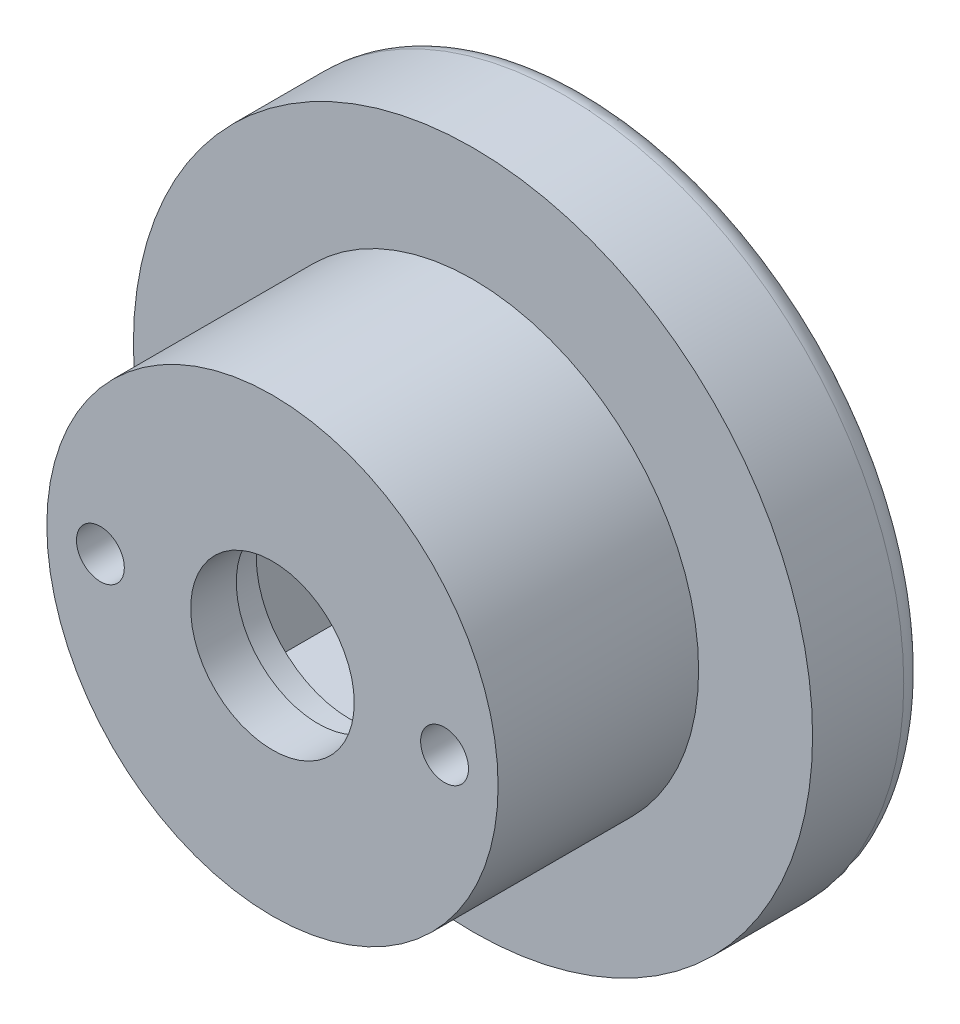
ISO-10303-21;
HEADER;
FILE_DESCRIPTION(('STEP AP214'),'2;1');
FILE_NAME('part.step','',(''),(''),'','','');
FILE_SCHEMA(('AUTOMOTIVE_DESIGN { 1 0 10303 214 1 1 1 1 }'));
ENDSEC;
DATA;
#1=APPLICATION_CONTEXT('core data for automotive mechanical design processes');
#2=APPLICATION_PROTOCOL_DEFINITION('international standard','automotive_design',2000,#1);
#3=PRODUCT_CONTEXT('',#1,'mechanical');
#4=PRODUCT('Part','Part','',(#3));
#5=PRODUCT_RELATED_PRODUCT_CATEGORY('part','',(#4));
#6=PRODUCT_DEFINITION_FORMATION('','',#4);
#7=PRODUCT_DEFINITION_CONTEXT('part definition',#1,'design');
#8=PRODUCT_DEFINITION('design','',#6,#7);
#9=PRODUCT_DEFINITION_SHAPE('','',#8);
#10=(LENGTH_UNIT() NAMED_UNIT(*) SI_UNIT(.MILLI.,.METRE.));
#11=(NAMED_UNIT(*) PLANE_ANGLE_UNIT() SI_UNIT($,.RADIAN.));
#12=(NAMED_UNIT(*) SI_UNIT($,.STERADIAN.) SOLID_ANGLE_UNIT());
#13=UNCERTAINTY_MEASURE_WITH_UNIT(LENGTH_MEASURE(1.E-05),#10,'distance_accuracy_value','');
#14=(GEOMETRIC_REPRESENTATION_CONTEXT(3) GLOBAL_UNCERTAINTY_ASSIGNED_CONTEXT((#13)) GLOBAL_UNIT_ASSIGNED_CONTEXT((#10,
#11,#12)) REPRESENTATION_CONTEXT('',''));
#15=CARTESIAN_POINT('',(0.,0.,0.));
#16=DIRECTION('',(0.,0.,1.));
#17=DIRECTION('',(1.,0.,0.));
#18=AXIS2_PLACEMENT_3D('',#15,#16,#17);
#19=CARTESIAN_POINT('',(0.,0.,-28.8904285349872));
#20=DIRECTION('',(0.,0.,1.));
#21=DIRECTION('',(1.,0.,0.));
#22=AXIS2_PLACEMENT_3D('',#19,#20,#21);
#23=CYLINDRICAL_SURFACE('',#22,9.89999999999998);
#24=CARTESIAN_POINT('',(0.,0.,-6.2976));
#25=DIRECTION('',(0.,0.,-1.));
#26=DIRECTION('',(-1.,0.,0.));
#27=AXIS2_PLACEMENT_3D('',#24,#25,#26);
#28=CIRCLE('',#27,9.89999999999998);
#29=CARTESIAN_POINT('',(-9.89999999999998,0.,-6.2976));
#30=VERTEX_POINT('',#29);
#31=EDGE_CURVE('E108',#30,#30,#28,.T.);
#32=ORIENTED_EDGE('',*,*,#31,.F.);
#33=EDGE_LOOP('',(#32));
#34=FACE_BOUND('',#33,.T.);
#35=CARTESIAN_POINT('',(0.,0.,2.5));
#36=DIRECTION('',(0.,0.,1.));
#37=DIRECTION('',(1.,0.,0.));
#38=AXIS2_PLACEMENT_3D('',#35,#36,#37);
#39=CIRCLE('',#38,9.89999999999998);
#40=CARTESIAN_POINT('',(9.89999999999998,0.,2.5));
#41=VERTEX_POINT('',#40);
#42=EDGE_CURVE('E147',#41,#41,#39,.T.);
#43=ORIENTED_EDGE('',*,*,#42,.F.);
#44=EDGE_LOOP('',(#43));
#45=FACE_BOUND('',#44,.T.);
#46=ADVANCED_FACE('F33',(#34,#45),#23,.T.);
#47=CARTESIAN_POINT('',(0.,0.,-28.8904285349872));
#48=DIRECTION('',(0.,0.,1.));
#49=DIRECTION('',(1.,0.,0.));
#50=AXIS2_PLACEMENT_3D('',#47,#48,#49);
#51=CYLINDRICAL_SURFACE('',#50,4.10050000000001);
#52=CARTESIAN_POINT('',(0.,0.,-0.889000000000001));
#53=DIRECTION('',(0.,0.,-1.));
#54=DIRECTION('',(-1.,0.,0.));
#55=AXIS2_PLACEMENT_3D('',#52,#53,#54);
#56=CIRCLE('',#55,4.10050000000001);
#57=CARTESIAN_POINT('',(-4.10050000000001,0.,-0.889000000000001));
#58=VERTEX_POINT('',#57);
#59=EDGE_CURVE('E111',#58,#58,#56,.F.);
#60=ORIENTED_EDGE('',*,*,#59,.F.);
#61=EDGE_LOOP('',(#60));
#62=FACE_BOUND('',#61,.T.);
#63=CARTESIAN_POINT('',(0.,0.,0.5));
#64=DIRECTION('',(0.,0.,1.));
#65=DIRECTION('',(1.,0.,0.));
#66=AXIS2_PLACEMENT_3D('',#63,#64,#65);
#67=CIRCLE('',#66,4.10050000000001);
#68=CARTESIAN_POINT('',(4.10050000000001,0.,0.5));
#69=VERTEX_POINT('',#68);
#70=EDGE_CURVE('E152',#69,#69,#67,.F.);
#71=ORIENTED_EDGE('',*,*,#70,.F.);
#72=EDGE_LOOP('',(#71));
#73=FACE_BOUND('',#72,.T.);
#74=ADVANCED_FACE('F178',(#62,#73),#51,.F.);
#75=CARTESIAN_POINT('',(6.096,-6.5024,-0.889));
#76=DIRECTION('',(0.,0.,-1.));
#77=DIRECTION('',(0.,1.,0.));
#78=AXIS2_PLACEMENT_3D('',#75,#76,#77);
#79=PLANE('',#78);
#80=DIRECTION('',(-1.,0.,0.));
#81=VECTOR('',#80,1.);
#82=CARTESIAN_POINT('',(-6.45,-6.6024,-0.889));
#83=LINE('',#82,#81);
#84=CARTESIAN_POINT('',(6.45,-6.6024,-0.889));
#85=VERTEX_POINT('',#84);
#86=CARTESIAN_POINT('',(-6.45,-6.6024,-0.889));
#87=VERTEX_POINT('',#86);
#88=EDGE_CURVE('E82',#85,#87,#83,.T.);
#89=ORIENTED_EDGE('',*,*,#88,.T.);
#90=DIRECTION('',(0.,1.,0.));
#91=VECTOR('',#90,1.);
#92=CARTESIAN_POINT('',(-6.45,-6.6024,-0.889));
#93=LINE('',#92,#91);
#94=CARTESIAN_POINT('',(-6.45,6.6024,-0.889));
#95=VERTEX_POINT('',#94);
#96=EDGE_CURVE('E107',#87,#95,#93,.T.);
#97=ORIENTED_EDGE('',*,*,#96,.T.);
#98=DIRECTION('',(1.,0.,0.));
#99=VECTOR('',#98,1.);
#100=CARTESIAN_POINT('',(-6.45,6.6024,-0.889));
#101=LINE('',#100,#99);
#102=CARTESIAN_POINT('',(6.45,6.6024,-0.889));
#103=VERTEX_POINT('',#102);
#104=EDGE_CURVE('E55',#95,#103,#101,.T.);
#105=ORIENTED_EDGE('',*,*,#104,.T.);
#106=DIRECTION('',(0.,-1.,0.));
#107=VECTOR('',#106,1.);
#108=CARTESIAN_POINT('',(6.45,-6.6024,-0.889));
#109=LINE('',#108,#107);
#110=EDGE_CURVE('E50',#103,#85,#109,.T.);
#111=ORIENTED_EDGE('',*,*,#110,.T.);
#112=EDGE_LOOP('',(#89,#97,#105,#111));
#113=FACE_BOUND('',#112,.T.);
#114=ORIENTED_EDGE('',*,*,#59,.T.);
#115=EDGE_LOOP('',(#114));
#116=FACE_BOUND('',#115,.T.);
#117=ADVANCED_FACE('F184',(#113,#116),#79,.T.);
#118=CARTESIAN_POINT('',(-6.45,-6.6024,-34.3990285349872));
#119=DIRECTION('',(0.,1.,0.));
#120=DIRECTION('',(0.,0.,1.));
#121=AXIS2_PLACEMENT_3D('',#118,#119,#120);
#122=PLANE('',#121);
#123=DIRECTION('',(0.,0.,1.));
#124=VECTOR('',#123,1.);
#125=CARTESIAN_POINT('',(6.45,-6.6024,-34.3990285349872));
#126=LINE('',#125,#124);
#127=CARTESIAN_POINT('',(6.45,-6.6024,-11.2976));
#128=VERTEX_POINT('',#127);
#129=EDGE_CURVE('E75',#128,#85,#126,.T.);
#130=ORIENTED_EDGE('',*,*,#129,.F.);
#131=DIRECTION('',(-1.,0.,0.));
#132=VECTOR('',#131,1.);
#133=CARTESIAN_POINT('',(6.45,-6.6024,-11.2976));
#134=LINE('',#133,#132);
#135=CARTESIAN_POINT('',(-6.45,-6.6024,-11.2976));
#136=VERTEX_POINT('',#135);
#137=EDGE_CURVE('E80',#128,#136,#134,.T.);
#138=ORIENTED_EDGE('',*,*,#137,.T.);
#139=DIRECTION('',(0.,0.,1.));
#140=VECTOR('',#139,1.);
#141=CARTESIAN_POINT('',(-6.45,-6.6024,-34.3990285349872));
#142=LINE('',#141,#140);
#143=EDGE_CURVE('E85',#136,#87,#142,.T.);
#144=ORIENTED_EDGE('',*,*,#143,.T.);
#145=ORIENTED_EDGE('',*,*,#88,.F.);
#146=EDGE_LOOP('',(#130,#138,#144,#145));
#147=FACE_BOUND('',#146,.T.);
#148=ADVANCED_FACE('F77',(#147),#122,.T.);
#149=CARTESIAN_POINT('',(6.45,-6.6024,-34.3990285349872));
#150=DIRECTION('',(-1.,0.,0.));
#151=DIRECTION('',(0.,-1.,0.));
#152=AXIS2_PLACEMENT_3D('',#149,#150,#151);
#153=PLANE('',#152);
#154=DIRECTION('',(0.,0.,1.));
#155=VECTOR('',#154,1.);
#156=CARTESIAN_POINT('',(6.45,6.6024,-34.3990285349872));
#157=LINE('',#156,#155);
#158=CARTESIAN_POINT('',(6.45,6.6024,-11.2976));
#159=VERTEX_POINT('',#158);
#160=EDGE_CURVE('E84',#159,#103,#157,.T.);
#161=ORIENTED_EDGE('',*,*,#160,.F.);
#162=DIRECTION('',(0.,-1.,0.));
#163=VECTOR('',#162,1.);
#164=CARTESIAN_POINT('',(6.45,6.6024,-11.2976));
#165=LINE('',#164,#163);
#166=EDGE_CURVE('E88',#159,#128,#165,.T.);
#167=ORIENTED_EDGE('',*,*,#166,.T.);
#168=ORIENTED_EDGE('',*,*,#129,.T.);
#169=ORIENTED_EDGE('',*,*,#110,.F.);
#170=EDGE_LOOP('',(#161,#167,#168,#169));
#171=FACE_BOUND('',#170,.T.);
#172=ADVANCED_FACE('F89',(#171),#153,.T.);
#173=CARTESIAN_POINT('',(-6.45,6.6024,-34.3990285349872));
#174=DIRECTION('',(0.,-1.,0.));
#175=DIRECTION('',(1.,0.,0.));
#176=AXIS2_PLACEMENT_3D('',#173,#174,#175);
#177=PLANE('',#176);
#178=DIRECTION('',(0.,0.,1.));
#179=VECTOR('',#178,1.);
#180=CARTESIAN_POINT('',(-6.45,6.6024,-34.3990285349872));
#181=LINE('',#180,#179);
#182=CARTESIAN_POINT('',(-6.45,6.6024,-11.2976));
#183=VERTEX_POINT('',#182);
#184=EDGE_CURVE('E112',#183,#95,#181,.T.);
#185=ORIENTED_EDGE('',*,*,#184,.F.);
#186=DIRECTION('',(1.,0.,0.));
#187=VECTOR('',#186,1.);
#188=CARTESIAN_POINT('',(-6.45,6.6024,-11.2976));
#189=LINE('',#188,#187);
#190=EDGE_CURVE('E99',#183,#159,#189,.T.);
#191=ORIENTED_EDGE('',*,*,#190,.T.);
#192=ORIENTED_EDGE('',*,*,#160,.T.);
#193=ORIENTED_EDGE('',*,*,#104,.F.);
#194=EDGE_LOOP('',(#185,#191,#192,#193));
#195=FACE_BOUND('',#194,.T.);
#196=ADVANCED_FACE('F230',(#195),#177,.T.);
#197=CARTESIAN_POINT('',(-6.45,-6.6024,-34.3990285349872));
#198=DIRECTION('',(1.,0.,0.));
#199=DIRECTION('',(0.,0.,-1.));
#200=AXIS2_PLACEMENT_3D('',#197,#198,#199);
#201=PLANE('',#200);
#202=ORIENTED_EDGE('',*,*,#143,.F.);
#203=DIRECTION('',(0.,1.,0.));
#204=VECTOR('',#203,1.);
#205=CARTESIAN_POINT('',(-6.45,-6.6024,-11.2976));
#206=LINE('',#205,#204);
#207=EDGE_CURVE('E97',#136,#183,#206,.T.);
#208=ORIENTED_EDGE('',*,*,#207,.T.);
#209=ORIENTED_EDGE('',*,*,#184,.T.);
#210=ORIENTED_EDGE('',*,*,#96,.F.);
#211=EDGE_LOOP('',(#202,#208,#209,#210));
#212=FACE_BOUND('',#211,.T.);
#213=ADVANCED_FACE('F190',(#212),#201,.T.);
#214=CARTESIAN_POINT('',(0.,0.,-11.2976));
#215=DIRECTION('',(0.,0.,-1.));
#216=DIRECTION('',(-1.,0.,0.));
#217=AXIS2_PLACEMENT_3D('',#214,#215,#216);
#218=PLANE('',#217);
#219=CARTESIAN_POINT('',(0.,0.,-11.2976));
#220=DIRECTION('',(0.,0.,-1.));
#221=DIRECTION('',(-1.,0.,0.));
#222=AXIS2_PLACEMENT_3D('',#219,#220,#221);
#223=CIRCLE('',#222,13.9);
#224=CARTESIAN_POINT('',(-13.9,0.,-11.2976));
#225=VERTEX_POINT('',#224);
#226=EDGE_CURVE('E42',#225,#225,#223,.T.);
#227=ORIENTED_EDGE('',*,*,#226,.T.);
#228=EDGE_LOOP('',(#227));
#229=FACE_BOUND('',#228,.T.);
#230=CARTESIAN_POINT('',(7.55,0.,-11.2976));
#231=DIRECTION('',(0.,0.,1.));
#232=DIRECTION('',(1.,0.,0.));
#233=AXIS2_PLACEMENT_3D('',#230,#231,#232);
#234=CIRCLE('',#233,1.04999999999999);
#235=CARTESIAN_POINT('',(8.59999999999999,0.,-11.2976));
#236=VERTEX_POINT('',#235);
#237=EDGE_CURVE('E157',#236,#236,#234,.T.);
#238=ORIENTED_EDGE('',*,*,#237,.T.);
#239=EDGE_LOOP('',(#238));
#240=FACE_BOUND('',#239,.T.);
#241=CARTESIAN_POINT('',(-7.54951177513323,0.0858601020535576,-11.2976));
#242=DIRECTION('',(0.,0.,1.));
#243=DIRECTION('',(1.,0.,0.));
#244=AXIS2_PLACEMENT_3D('',#241,#242,#243);
#245=CIRCLE('',#244,1.05);
#246=CARTESIAN_POINT('',(-6.49951177513323,0.0858601020535576,-11.2976));
#247=VERTEX_POINT('',#246);
#248=EDGE_CURVE('E93',#247,#247,#245,.T.);
#249=ORIENTED_EDGE('',*,*,#248,.T.);
#250=EDGE_LOOP('',(#249));
#251=FACE_BOUND('',#250,.T.);
#252=ORIENTED_EDGE('',*,*,#137,.F.);
#253=ORIENTED_EDGE('',*,*,#166,.F.);
#254=ORIENTED_EDGE('',*,*,#190,.F.);
#255=ORIENTED_EDGE('',*,*,#207,.F.);
#256=EDGE_LOOP('',(#252,#253,#254,#255));
#257=FACE_BOUND('',#256,.T.);
#258=ADVANCED_FACE('F95',(#229,#240,#251,#257),#218,.T.);
#259=CARTESIAN_POINT('',(0.,0.,-6.2976));
#260=DIRECTION('',(0.,0.,-1.));
#261=DIRECTION('',(-1.,0.,0.));
#262=AXIS2_PLACEMENT_3D('',#259,#260,#261);
#263=PLANE('',#262);
#264=ORIENTED_EDGE('',*,*,#31,.T.);
#265=EDGE_LOOP('',(#264));
#266=FACE_BOUND('',#265,.T.);
#267=CARTESIAN_POINT('',(0.,0.,-6.2976));
#268=DIRECTION('',(0.,0.,-1.));
#269=DIRECTION('',(-1.,0.,0.));
#270=AXIS2_PLACEMENT_3D('',#267,#268,#269);
#271=CIRCLE('',#270,14.9);
#272=CARTESIAN_POINT('',(-14.9,0.,-6.2976));
#273=VERTEX_POINT('',#272);
#274=EDGE_CURVE('E104',#273,#273,#271,.T.);
#275=ORIENTED_EDGE('',*,*,#274,.F.);
#276=EDGE_LOOP('',(#275));
#277=FACE_BOUND('',#276,.T.);
#278=ADVANCED_FACE('F173',(#266,#277),#263,.F.);
#279=CARTESIAN_POINT('',(0.,0.,-11.2976));
#280=DIRECTION('',(0.,0.,1.));
#281=DIRECTION('',(1.,0.,0.));
#282=AXIS2_PLACEMENT_3D('',#279,#280,#281);
#283=CYLINDRICAL_SURFACE('',#282,14.9);
#284=CARTESIAN_POINT('',(0.,0.,-10.2976));
#285=DIRECTION('',(0.,0.,-1.));
#286=DIRECTION('',(-1.,0.,0.));
#287=AXIS2_PLACEMENT_3D('',#284,#285,#286);
#288=CIRCLE('',#287,14.9);
#289=CARTESIAN_POINT('',(-14.9,0.,-10.2976));
#290=VERTEX_POINT('',#289);
#291=EDGE_CURVE('E11',#290,#290,#288,.F.);
#292=ORIENTED_EDGE('',*,*,#291,.T.);
#293=EDGE_LOOP('',(#292));
#294=FACE_BOUND('',#293,.T.);
#295=ORIENTED_EDGE('',*,*,#274,.T.);
#296=EDGE_LOOP('',(#295));
#297=FACE_BOUND('',#296,.T.);
#298=ADVANCED_FACE('F165',(#294,#297),#283,.T.);
#299=CARTESIAN_POINT('',(-7.54951177513323,0.0858601020535576,-11.2976));
#300=DIRECTION('',(0.,0.,1.));
#301=DIRECTION('',(1.,0.,0.));
#302=AXIS2_PLACEMENT_3D('',#299,#300,#301);
#303=CYLINDRICAL_SURFACE('',#302,1.05);
#304=ORIENTED_EDGE('',*,*,#248,.F.);
#305=EDGE_LOOP('',(#304));
#306=FACE_BOUND('',#305,.T.);
#307=CARTESIAN_POINT('',(-7.54951177513323,0.0858601020535575,2.5));
#308=DIRECTION('',(0.,0.,1.));
#309=DIRECTION('',(1.,0.,0.));
#310=AXIS2_PLACEMENT_3D('',#307,#308,#309);
#311=CIRCLE('',#310,1.05);
#312=CARTESIAN_POINT('',(-6.49951177513323,0.0858601020535575,2.5));
#313=VERTEX_POINT('',#312);
#314=EDGE_CURVE('E37',#313,#313,#311,.T.);
#315=ORIENTED_EDGE('',*,*,#314,.T.);
#316=EDGE_LOOP('',(#315));
#317=FACE_BOUND('',#316,.T.);
#318=ADVANCED_FACE('F135',(#306,#317),#303,.F.);
#319=CARTESIAN_POINT('',(7.55,0.,-11.2976));
#320=DIRECTION('',(0.,0.,1.));
#321=DIRECTION('',(1.,0.,0.));
#322=AXIS2_PLACEMENT_3D('',#319,#320,#321);
#323=CYLINDRICAL_SURFACE('',#322,1.04999999999999);
#324=ORIENTED_EDGE('',*,*,#237,.F.);
#325=EDGE_LOOP('',(#324));
#326=FACE_BOUND('',#325,.T.);
#327=CARTESIAN_POINT('',(7.55,0.,2.5));
#328=DIRECTION('',(0.,0.,1.));
#329=DIRECTION('',(1.,0.,0.));
#330=AXIS2_PLACEMENT_3D('',#327,#328,#329);
#331=CIRCLE('',#330,1.05);
#332=CARTESIAN_POINT('',(8.6,0.,2.5));
#333=VERTEX_POINT('',#332);
#334=EDGE_CURVE('E124',#333,#333,#331,.T.);
#335=ORIENTED_EDGE('',*,*,#334,.T.);
#336=EDGE_LOOP('',(#335));
#337=FACE_BOUND('',#336,.T.);
#338=ADVANCED_FACE('F164',(#326,#337),#323,.F.);
#339=CARTESIAN_POINT('',(0.,0.,0.5));
#340=DIRECTION('',(0.,0.,1.));
#341=DIRECTION('',(1.,0.,0.));
#342=AXIS2_PLACEMENT_3D('',#339,#340,#341);
#343=PLANE('',#342);
#344=CARTESIAN_POINT('',(0.,0.,0.5));
#345=DIRECTION('',(0.,0.,1.));
#346=DIRECTION('',(1.,0.,0.));
#347=AXIS2_PLACEMENT_3D('',#344,#345,#346);
#348=CIRCLE('',#347,3.58745662856812);
#349=CARTESIAN_POINT('',(3.58745662856812,0.,0.5));
#350=VERTEX_POINT('',#349);
#351=EDGE_CURVE('E126',#350,#350,#348,.T.);
#352=ORIENTED_EDGE('',*,*,#351,.T.);
#353=EDGE_LOOP('',(#352));
#354=FACE_BOUND('',#353,.T.);
#355=ORIENTED_EDGE('',*,*,#70,.T.);
#356=EDGE_LOOP('',(#355));
#357=FACE_BOUND('',#356,.T.);
#358=ADVANCED_FACE('F141',(#354,#357),#343,.F.);
#359=CARTESIAN_POINT('',(0.,0.,2.5));
#360=DIRECTION('',(0.,0.,1.));
#361=DIRECTION('',(1.,0.,0.));
#362=AXIS2_PLACEMENT_3D('',#359,#360,#361);
#363=PLANE('',#362);
#364=ORIENTED_EDGE('',*,*,#314,.F.);
#365=EDGE_LOOP('',(#364));
#366=FACE_BOUND('',#365,.T.);
#367=ORIENTED_EDGE('',*,*,#334,.F.);
#368=EDGE_LOOP('',(#367));
#369=FACE_BOUND('',#368,.T.);
#370=ORIENTED_EDGE('',*,*,#42,.T.);
#371=EDGE_LOOP('',(#370));
#372=FACE_BOUND('',#371,.T.);
#373=CARTESIAN_POINT('',(0.,0.,2.5));
#374=DIRECTION('',(0.,0.,1.));
#375=DIRECTION('',(1.,0.,0.));
#376=AXIS2_PLACEMENT_3D('',#373,#374,#375);
#377=CIRCLE('',#376,3.58745662856812);
#378=CARTESIAN_POINT('',(3.58745662856812,0.,2.5));
#379=VERTEX_POINT('',#378);
#380=EDGE_CURVE('E130',#379,#379,#377,.T.);
#381=ORIENTED_EDGE('',*,*,#380,.F.);
#382=EDGE_LOOP('',(#381));
#383=FACE_BOUND('',#382,.T.);
#384=ADVANCED_FACE('F137',(#366,#369,#372,#383),#363,.T.);
#385=CARTESIAN_POINT('',(0.,0.,2.5));
#386=DIRECTION('',(0.,0.,-1.));
#387=DIRECTION('',(-1.,0.,0.));
#388=AXIS2_PLACEMENT_3D('',#385,#386,#387);
#389=CYLINDRICAL_SURFACE('',#388,3.58745662856812);
#390=ORIENTED_EDGE('',*,*,#380,.T.);
#391=EDGE_LOOP('',(#390));
#392=FACE_BOUND('',#391,.T.);
#393=ORIENTED_EDGE('',*,*,#351,.F.);
#394=EDGE_LOOP('',(#393));
#395=FACE_BOUND('',#394,.T.);
#396=ADVANCED_FACE('F140',(#392,#395),#389,.F.);
#397=CARTESIAN_POINT('',(0.,0.,-10.2976));
#398=DIRECTION('',(0.,0.,-1.));
#399=DIRECTION('',(-1.,0.,0.));
#400=AXIS2_PLACEMENT_3D('',#397,#398,#399);
#401=TOROIDAL_SURFACE('',#400,13.9,1.);
#402=ORIENTED_EDGE('',*,*,#291,.F.);
#403=EDGE_LOOP('',(#402));
#404=FACE_BOUND('',#403,.T.);
#405=ORIENTED_EDGE('',*,*,#226,.F.);
#406=EDGE_LOOP('',(#405));
#407=FACE_BOUND('',#406,.T.);
#408=ADVANCED_FACE('F35',(#404,#407),#401,.T.);
#409=CLOSED_SHELL('',(#46,#74,#117,#148,#172,#196,#213,#258,#278,#298,#318,#338,#358,#384,#396,#408));
#410=MANIFOLD_SOLID_BREP('B2',#409);
#411=ADVANCED_BREP_SHAPE_REPRESENTATION('',(#18,#410),#14);
#412=SHAPE_DEFINITION_REPRESENTATION(#9,#411);
ENDSEC;
END-ISO-10303-21;
